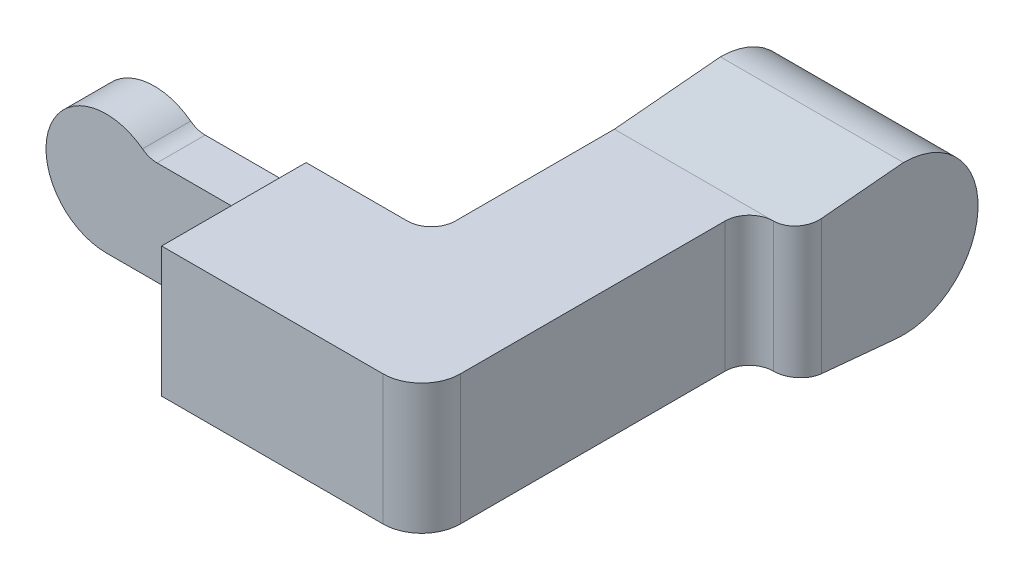
ISO-10303-21;
HEADER;
FILE_DESCRIPTION(('STEP AP214'),'2;1');
FILE_NAME('part.step','',(''),(''),'','','');
FILE_SCHEMA(('AUTOMOTIVE_DESIGN { 1 0 10303 214 1 1 1 1 }'));
ENDSEC;
DATA;
#1=APPLICATION_CONTEXT('core data for automotive mechanical design processes');
#2=APPLICATION_PROTOCOL_DEFINITION('international standard','automotive_design',2000,#1);
#3=PRODUCT_CONTEXT('',#1,'mechanical');
#4=PRODUCT('Part','Part','',(#3));
#5=PRODUCT_RELATED_PRODUCT_CATEGORY('part','',(#4));
#6=PRODUCT_DEFINITION_FORMATION('','',#4);
#7=PRODUCT_DEFINITION_CONTEXT('part definition',#1,'design');
#8=PRODUCT_DEFINITION('design','',#6,#7);
#9=PRODUCT_DEFINITION_SHAPE('','',#8);
#10=(LENGTH_UNIT() NAMED_UNIT(*) SI_UNIT(.MILLI.,.METRE.));
#11=(NAMED_UNIT(*) PLANE_ANGLE_UNIT() SI_UNIT($,.RADIAN.));
#12=(NAMED_UNIT(*) SI_UNIT($,.STERADIAN.) SOLID_ANGLE_UNIT());
#13=UNCERTAINTY_MEASURE_WITH_UNIT(LENGTH_MEASURE(1.E-05),#10,'distance_accuracy_value','');
#14=(GEOMETRIC_REPRESENTATION_CONTEXT(3) GLOBAL_UNCERTAINTY_ASSIGNED_CONTEXT((#13)) GLOBAL_UNIT_ASSIGNED_CONTEXT((#10,
#11,#12)) REPRESENTATION_CONTEXT('',''));
#15=CARTESIAN_POINT('',(0.,0.,0.));
#16=DIRECTION('',(0.,0.,1.));
#17=DIRECTION('',(1.,0.,0.));
#18=AXIS2_PLACEMENT_3D('',#15,#16,#17);
#19=CARTESIAN_POINT('',(59.,0.,-73.));
#20=DIRECTION('',(0.,-1.,0.));
#21=DIRECTION('',(0.,0.,-1.));
#22=AXIS2_PLACEMENT_3D('',#19,#20,#21);
#23=CYLINDRICAL_SURFACE('',#22,5.);
#24=DIRECTION('',(0.,1.,0.));
#25=VECTOR('',#24,1.);
#26=CARTESIAN_POINT('',(59.,-13.5,-68.));
#27=LINE('',#26,#25);
#28=CARTESIAN_POINT('',(59.,13.5,-68.));
#29=VERTEX_POINT('',#28);
#30=CARTESIAN_POINT('',(59.,-13.5,-68.));
#31=VERTEX_POINT('',#30);
#32=EDGE_CURVE('E291',#29,#31,#27,.F.);
#33=ORIENTED_EDGE('',*,*,#32,.T.);
#34=CARTESIAN_POINT('',(59.,-13.970079904175,-73.));
#35=DIRECTION('',(0.,-0.995609581526614,0.0936032113359417));
#36=DIRECTION('',(0.,-0.0936032113359417,-0.995609581526614));
#37=AXIS2_PLACEMENT_3D('',#34,#35,#36);
#38=ELLIPSE('',#37,5.02204889624834,5.);
#39=CARTESIAN_POINT('',(64.,-13.970079904175,-73.));
#40=VERTEX_POINT('',#39);
#41=EDGE_CURVE('E41',#40,#31,#38,.T.);
#42=ORIENTED_EDGE('',*,*,#41,.F.);
#43=DIRECTION('',(0.,1.,0.));
#44=VECTOR('',#43,1.);
#45=CARTESIAN_POINT('',(64.,0.,-73.));
#46=LINE('',#45,#44);
#47=CARTESIAN_POINT('',(64.,13.9545454545455,-73.));
#48=VERTEX_POINT('',#47);
#49=EDGE_CURVE('E298',#48,#40,#46,.F.);
#50=ORIENTED_EDGE('',*,*,#49,.F.);
#51=CARTESIAN_POINT('',(59.,13.9545454545455,-73.));
#52=DIRECTION('',(0.,0.995893206467704,0.0905357460425184));
#53=DIRECTION('',(0.,-0.0905357460425184,0.995893206467704));
#54=AXIS2_PLACEMENT_3D('',#51,#52,#53);
#55=ELLIPSE('',#54,5.02061864417603,5.);
#56=EDGE_CURVE('E11',#29,#48,#55,.T.);
#57=ORIENTED_EDGE('',*,*,#56,.F.);
#58=EDGE_LOOP('',(#33,#42,#50,#57));
#59=FACE_BOUND('',#58,.T.);
#60=ADVANCED_FACE('F34',(#59),#23,.T.);
#61=CARTESIAN_POINT('',(59.,-13.5,-63.));
#62=DIRECTION('',(0.,-1.,0.));
#63=DIRECTION('',(0.,0.,-1.));
#64=AXIS2_PLACEMENT_3D('',#61,#62,#63);
#65=CYLINDRICAL_SURFACE('',#64,5.);
#66=DIRECTION('',(0.,1.,0.));
#67=VECTOR('',#66,1.);
#68=CARTESIAN_POINT('',(54.,-13.5,-63.));
#69=LINE('',#68,#67);
#70=CARTESIAN_POINT('',(54.,-13.5,-63.));
#71=VERTEX_POINT('',#70);
#72=CARTESIAN_POINT('',(54.,13.5,-63.));
#73=VERTEX_POINT('',#72);
#74=EDGE_CURVE('E269',#71,#73,#69,.T.);
#75=ORIENTED_EDGE('',*,*,#74,.F.);
#76=CARTESIAN_POINT('',(59.,-13.5,-63.));
#77=DIRECTION('',(0.,1.,0.));
#78=DIRECTION('',(0.,0.,1.));
#79=AXIS2_PLACEMENT_3D('',#76,#77,#78);
#80=CIRCLE('',#79,5.);
#81=EDGE_CURVE('E293',#71,#31,#80,.F.);
#82=ORIENTED_EDGE('',*,*,#81,.T.);
#83=ORIENTED_EDGE('',*,*,#32,.F.);
#84=CARTESIAN_POINT('',(59.,13.5,-63.));
#85=DIRECTION('',(0.,1.,0.));
#86=DIRECTION('',(0.,0.,1.));
#87=AXIS2_PLACEMENT_3D('',#84,#85,#86);
#88=CIRCLE('',#87,5.);
#89=EDGE_CURVE('E296',#29,#73,#88,.T.);
#90=ORIENTED_EDGE('',*,*,#89,.T.);
#91=EDGE_LOOP('',(#75,#82,#83,#90));
#92=FACE_BOUND('',#91,.T.);
#93=ADVANCED_FACE('F313',(#92),#65,.F.);
#94=CARTESIAN_POINT('',(-2.,-1.,-18.));
#95=DIRECTION('',(0.,-1.,0.));
#96=DIRECTION('',(0.,0.,-1.));
#97=AXIS2_PLACEMENT_3D('',#94,#95,#96);
#98=CYLINDRICAL_SURFACE('',#97,2.);
#99=CARTESIAN_POINT('',(-2.,9.96210215487392,-18.));
#100=DIRECTION('',(0.,0.707106781186547,-0.707106781186547));
#101=DIRECTION('',(0.,-0.707106781186547,-0.707106781186547));
#102=AXIS2_PLACEMENT_3D('',#99,#100,#101);
#103=ELLIPSE('',#102,2.82842712474619,2.);
#104=CARTESIAN_POINT('',(-2.,7.96210215487392,-20.));
#105=VERTEX_POINT('',#104);
#106=CARTESIAN_POINT('',(0.,9.96210215487392,-18.));
#107=VERTEX_POINT('',#106);
#108=EDGE_CURVE('E265',#105,#107,#103,.F.);
#109=ORIENTED_EDGE('',*,*,#108,.F.);
#110=DIRECTION('',(0.,1.,0.));
#111=VECTOR('',#110,1.);
#112=CARTESIAN_POINT('',(-2.,-1.,-20.));
#113=LINE('',#112,#111);
#114=CARTESIAN_POINT('',(-2.,-13.5,-20.));
#115=VERTEX_POINT('',#114);
#116=EDGE_CURVE('E231',#115,#105,#113,.T.);
#117=ORIENTED_EDGE('',*,*,#116,.F.);
#118=CARTESIAN_POINT('',(-2.,-13.5,-18.));
#119=DIRECTION('',(0.,1.,0.));
#120=DIRECTION('',(0.,0.,1.));
#121=AXIS2_PLACEMENT_3D('',#118,#119,#120);
#122=CIRCLE('',#121,2.);
#123=CARTESIAN_POINT('',(0.,-13.5,-18.));
#124=VERTEX_POINT('',#123);
#125=EDGE_CURVE('E263',#115,#124,#122,.F.);
#126=ORIENTED_EDGE('',*,*,#125,.T.);
#127=DIRECTION('',(0.,1.,0.));
#128=VECTOR('',#127,1.);
#129=CARTESIAN_POINT('',(0.,-1.,-18.));
#130=LINE('',#129,#128);
#131=EDGE_CURVE('E259',#107,#124,#130,.F.);
#132=ORIENTED_EDGE('',*,*,#131,.F.);
#133=EDGE_LOOP('',(#109,#117,#126,#132));
#134=FACE_BOUND('',#133,.T.);
#135=ADVANCED_FACE('F383',(#134),#98,.F.);
#136=CARTESIAN_POINT('',(-2.,9.96210215487392,-20.));
#137=DIRECTION('',(0.,0.,-1.));
#138=DIRECTION('',(-1.,0.,0.));
#139=AXIS2_PLACEMENT_3D('',#136,#137,#138);
#140=CYLINDRICAL_SURFACE('',#139,2.);
#141=DIRECTION('',(0.,0.,-1.));
#142=VECTOR('',#141,1.);
#143=CARTESIAN_POINT('',(-2.,7.96210215487392,-20.));
#144=LINE('',#143,#142);
#145=CARTESIAN_POINT('',(-2.,7.96210215487392,-30.));
#146=VERTEX_POINT('',#145);
#147=EDGE_CURVE('E260',#105,#146,#144,.T.);
#148=ORIENTED_EDGE('',*,*,#147,.F.);
#149=ORIENTED_EDGE('',*,*,#108,.T.);
#150=DIRECTION('',(0.,0.,-1.));
#151=VECTOR('',#150,1.);
#152=CARTESIAN_POINT('',(0.,9.96210215487392,-15.));
#153=LINE('',#152,#151);
#154=CARTESIAN_POINT('',(0.,9.96210215487392,-30.));
#155=VERTEX_POINT('',#154);
#156=EDGE_CURVE('E237',#155,#107,#153,.F.);
#157=ORIENTED_EDGE('',*,*,#156,.F.);
#158=CARTESIAN_POINT('',(-2.,9.96210215487392,-30.));
#159=DIRECTION('',(0.,0.,-1.));
#160=DIRECTION('',(-1.,0.,0.));
#161=AXIS2_PLACEMENT_3D('',#158,#159,#160);
#162=CIRCLE('',#161,2.);
#163=EDGE_CURVE('E267',#155,#146,#162,.T.);
#164=ORIENTED_EDGE('',*,*,#163,.T.);
#165=EDGE_LOOP('',(#148,#149,#157,#164));
#166=FACE_BOUND('',#165,.T.);
#167=ADVANCED_FACE('F359',(#166),#140,.F.);
#168=CARTESIAN_POINT('',(0.,-13.5,-15.));
#169=DIRECTION('',(-1.,0.,0.));
#170=DIRECTION('',(0.,0.,1.));
#171=AXIS2_PLACEMENT_3D('',#168,#169,#170);
#172=PLANE('',#171);
#173=ORIENTED_EDGE('',*,*,#156,.T.);
#174=ORIENTED_EDGE('',*,*,#131,.T.);
#175=DIRECTION('',(0.,0.,1.));
#176=VECTOR('',#175,1.);
#177=CARTESIAN_POINT('',(0.,-13.5,-15.));
#178=LINE('',#177,#176);
#179=CARTESIAN_POINT('',(0.,-13.5,0.));
#180=VERTEX_POINT('',#179);
#181=EDGE_CURVE('E223',#124,#180,#178,.T.);
#182=ORIENTED_EDGE('',*,*,#181,.T.);
#183=DIRECTION('',(0.,1.,0.));
#184=VECTOR('',#183,1.);
#185=CARTESIAN_POINT('',(0.,-13.5,0.));
#186=LINE('',#185,#184);
#187=CARTESIAN_POINT('',(0.,13.5,0.));
#188=VERTEX_POINT('',#187);
#189=EDGE_CURVE('E251',#180,#188,#186,.T.);
#190=ORIENTED_EDGE('',*,*,#189,.T.);
#191=DIRECTION('',(0.,0.,1.));
#192=VECTOR('',#191,1.);
#193=CARTESIAN_POINT('',(0.,13.5,-15.));
#194=LINE('',#193,#192);
#195=CARTESIAN_POINT('',(0.,13.5,-30.));
#196=VERTEX_POINT('',#195);
#197=EDGE_CURVE('E203',#196,#188,#194,.T.);
#198=ORIENTED_EDGE('',*,*,#197,.F.);
#199=DIRECTION('',(0.,1.,0.));
#200=VECTOR('',#199,1.);
#201=CARTESIAN_POINT('',(0.,-13.5,-30.));
#202=LINE('',#201,#200);
#203=EDGE_CURVE('E233',#155,#196,#202,.T.);
#204=ORIENTED_EDGE('',*,*,#203,.F.);
#205=EDGE_LOOP('',(#173,#174,#182,#190,#198,#204));
#206=FACE_BOUND('',#205,.T.);
#207=ADVANCED_FACE('F366',(#206),#172,.T.);
#208=CARTESIAN_POINT('',(21.,-13.5,-30.));
#209=DIRECTION('',(0.,0.,-1.));
#210=DIRECTION('',(-1.,0.,0.));
#211=AXIS2_PLACEMENT_3D('',#208,#209,#210);
#212=PLANE('',#211);
#213=ORIENTED_EDGE('',*,*,#163,.F.);
#214=ORIENTED_EDGE('',*,*,#203,.T.);
#215=DIRECTION('',(-1.,0.,0.));
#216=VECTOR('',#215,1.);
#217=CARTESIAN_POINT('',(21.,13.5,-30.));
#218=LINE('',#217,#216);
#219=CARTESIAN_POINT('',(21.,13.5,-30.));
#220=VERTEX_POINT('',#219);
#221=EDGE_CURVE('E220',#220,#196,#218,.T.);
#222=ORIENTED_EDGE('',*,*,#221,.F.);
#223=DIRECTION('',(0.,1.,0.));
#224=VECTOR('',#223,1.);
#225=CARTESIAN_POINT('',(21.,-13.5,-30.));
#226=LINE('',#225,#224);
#227=CARTESIAN_POINT('',(21.,-13.5,-30.));
#228=VERTEX_POINT('',#227);
#229=EDGE_CURVE('E236',#228,#220,#226,.T.);
#230=ORIENTED_EDGE('',*,*,#229,.F.);
#231=DIRECTION('',(-1.,0.,0.));
#232=VECTOR('',#231,1.);
#233=CARTESIAN_POINT('',(21.,-13.5,-30.));
#234=LINE('',#233,#232);
#235=CARTESIAN_POINT('',(-31.5,-13.5,-30.));
#236=VERTEX_POINT('',#235);
#237=EDGE_CURVE('E242',#228,#236,#234,.T.);
#238=ORIENTED_EDGE('',*,*,#237,.T.);
#239=CARTESIAN_POINT('',(-31.5,-1.,-30.));
#240=DIRECTION('',(0.,0.,1.));
#241=DIRECTION('',(1.,0.,0.));
#242=AXIS2_PLACEMENT_3D('',#239,#240,#241);
#243=CIRCLE('',#242,12.5);
#244=CARTESIAN_POINT('',(-23.9640418652566,8.97293011062423,-30.));
#245=VERTEX_POINT('',#244);
#246=EDGE_CURVE('E185',#245,#236,#243,.T.);
#247=ORIENTED_EDGE('',*,*,#246,.F.);
#248=CARTESIAN_POINT('',(-20.9496586113593,12.9621021548739,-30.));
#249=DIRECTION('',(0.,0.,-1.));
#250=DIRECTION('',(-1.,0.,0.));
#251=AXIS2_PLACEMENT_3D('',#248,#249,#250);
#252=CIRCLE('',#251,5.);
#253=CARTESIAN_POINT('',(-20.9496586113593,7.96210215487392,-30.));
#254=VERTEX_POINT('',#253);
#255=EDGE_CURVE('E190',#254,#245,#252,.T.);
#256=ORIENTED_EDGE('',*,*,#255,.F.);
#257=DIRECTION('',(-1.,0.,0.));
#258=VECTOR('',#257,1.);
#259=CARTESIAN_POINT('',(0.,7.96210215487392,-30.));
#260=LINE('',#259,#258);
#261=EDGE_CURVE('E180',#146,#254,#260,.T.);
#262=ORIENTED_EDGE('',*,*,#261,.F.);
#263=EDGE_LOOP('',(#213,#214,#222,#230,#238,#247,#256,#262));
#264=FACE_BOUND('',#263,.T.);
#265=ADVANCED_FACE('F335',(#264),#212,.T.);
#266=CARTESIAN_POINT('',(21.,-13.5,-35.));
#267=DIRECTION('',(0.,1.,0.));
#268=DIRECTION('',(0.,0.,1.));
#269=AXIS2_PLACEMENT_3D('',#266,#267,#268);
#270=CYLINDRICAL_SURFACE('',#269,5.);
#271=ORIENTED_EDGE('',*,*,#229,.T.);
#272=CARTESIAN_POINT('',(21.,13.5,-35.));
#273=DIRECTION('',(0.,-1.,0.));
#274=DIRECTION('',(0.,0.,1.));
#275=AXIS2_PLACEMENT_3D('',#272,#273,#274);
#276=CIRCLE('',#275,5.);
#277=CARTESIAN_POINT('',(26.,13.5,-35.));
#278=VERTEX_POINT('',#277);
#279=EDGE_CURVE('E216',#278,#220,#276,.T.);
#280=ORIENTED_EDGE('',*,*,#279,.F.);
#281=DIRECTION('',(0.,1.,0.));
#282=VECTOR('',#281,1.);
#283=CARTESIAN_POINT('',(26.,-13.5,-35.));
#284=LINE('',#283,#282);
#285=CARTESIAN_POINT('',(26.,-13.5,-35.));
#286=VERTEX_POINT('',#285);
#287=EDGE_CURVE('E245',#286,#278,#284,.T.);
#288=ORIENTED_EDGE('',*,*,#287,.F.);
#289=CARTESIAN_POINT('',(21.,-13.5,-35.));
#290=DIRECTION('',(0.,-1.,0.));
#291=DIRECTION('',(0.,0.,1.));
#292=AXIS2_PLACEMENT_3D('',#289,#290,#291);
#293=CIRCLE('',#292,5.);
#294=EDGE_CURVE('E329',#286,#228,#293,.T.);
#295=ORIENTED_EDGE('',*,*,#294,.T.);
#296=EDGE_LOOP('',(#271,#280,#288,#295));
#297=FACE_BOUND('',#296,.T.);
#298=ADVANCED_FACE('F368',(#297),#270,.F.);
#299=CARTESIAN_POINT('',(26.,-13.5,-68.));
#300=DIRECTION('',(-1.,0.,0.));
#301=DIRECTION('',(0.,0.,1.));
#302=AXIS2_PLACEMENT_3D('',#299,#300,#301);
#303=PLANE('',#302);
#304=ORIENTED_EDGE('',*,*,#287,.T.);
#305=DIRECTION('',(0.,0.,1.));
#306=VECTOR('',#305,1.);
#307=CARTESIAN_POINT('',(26.,13.5,-68.));
#308=LINE('',#307,#306);
#309=CARTESIAN_POINT('',(26.,13.5,-68.));
#310=VERTEX_POINT('',#309);
#311=EDGE_CURVE('E213',#310,#278,#308,.T.);
#312=ORIENTED_EDGE('',*,*,#311,.F.);
#313=DIRECTION('',(0.,0.0905357460425184,-0.995893206467704));
#314=VECTOR('',#313,1.);
#315=CARTESIAN_POINT('',(26.,7.25819672131148,0.659836065573768));
#316=LINE('',#315,#314);
#317=CARTESIAN_POINT('',(26.,15.5,-90.));
#318=VERTEX_POINT('',#317);
#319=EDGE_CURVE('E175',#310,#318,#316,.T.);
#320=ORIENTED_EDGE('',*,*,#319,.T.);
#321=CARTESIAN_POINT('',(26.,0.,-90.));
#322=DIRECTION('',(-1.,0.,0.));
#323=DIRECTION('',(0.,0.,1.));
#324=AXIS2_PLACEMENT_3D('',#321,#322,#323);
#325=CIRCLE('',#324,15.5);
#326=CARTESIAN_POINT('',(26.,-15.4319485136625,-88.5491502242929));
#327=VERTEX_POINT('',#326);
#328=EDGE_CURVE('E164',#318,#327,#325,.T.);
#329=ORIENTED_EDGE('',*,*,#328,.T.);
#330=DIRECTION('',(0.,0.0936032113359417,0.995609581526614));
#331=VECTOR('',#330,1.);
#332=CARTESIAN_POINT('',(26.,-7.04464564756735,0.662309270191007));
#333=LINE('',#332,#331);
#334=CARTESIAN_POINT('',(26.,-13.5,-68.));
#335=VERTEX_POINT('',#334);
#336=EDGE_CURVE('E158',#327,#335,#333,.T.);
#337=ORIENTED_EDGE('',*,*,#336,.T.);
#338=DIRECTION('',(0.,0.,1.));
#339=VECTOR('',#338,1.);
#340=CARTESIAN_POINT('',(26.,-13.5,-68.));
#341=LINE('',#340,#339);
#342=EDGE_CURVE('E280',#335,#286,#341,.T.);
#343=ORIENTED_EDGE('',*,*,#342,.T.);
#344=EDGE_LOOP('',(#304,#312,#320,#329,#337,#343));
#345=FACE_BOUND('',#344,.T.);
#346=ADVANCED_FACE('F370',(#345),#303,.T.);
#347=CARTESIAN_POINT('',(54.,-13.5,-8.00000000000006));
#348=DIRECTION('',(1.,0.,0.));
#349=DIRECTION('',(0.,0.,-1.));
#350=AXIS2_PLACEMENT_3D('',#347,#348,#349);
#351=PLANE('',#350);
#352=DIRECTION('',(0.,0.,-1.));
#353=VECTOR('',#352,1.);
#354=CARTESIAN_POINT('',(54.,-13.5,-8.00000000000006));
#355=LINE('',#354,#353);
#356=CARTESIAN_POINT('',(54.,-13.5,-8.00000000000005));
#357=VERTEX_POINT('',#356);
#358=EDGE_CURVE('E281',#357,#71,#355,.T.);
#359=ORIENTED_EDGE('',*,*,#358,.T.);
#360=ORIENTED_EDGE('',*,*,#74,.T.);
#361=DIRECTION('',(0.,0.,-1.));
#362=VECTOR('',#361,1.);
#363=CARTESIAN_POINT('',(54.,13.5,-8.00000000000006));
#364=LINE('',#363,#362);
#365=CARTESIAN_POINT('',(54.,13.5,-8.00000000000005));
#366=VERTEX_POINT('',#365);
#367=EDGE_CURVE('E212',#366,#73,#364,.T.);
#368=ORIENTED_EDGE('',*,*,#367,.F.);
#369=DIRECTION('',(0.,1.,0.));
#370=VECTOR('',#369,1.);
#371=CARTESIAN_POINT('',(54.,-13.5,-8.00000000000005));
#372=LINE('',#371,#370);
#373=EDGE_CURVE('E247',#357,#366,#372,.T.);
#374=ORIENTED_EDGE('',*,*,#373,.F.);
#375=EDGE_LOOP('',(#359,#360,#368,#374));
#376=FACE_BOUND('',#375,.T.);
#377=ADVANCED_FACE('F320',(#376),#351,.T.);
#378=CARTESIAN_POINT('',(46.,-13.5,-8.));
#379=DIRECTION('',(0.,1.,0.));
#380=DIRECTION('',(0.,0.,1.));
#381=AXIS2_PLACEMENT_3D('',#378,#379,#380);
#382=CYLINDRICAL_SURFACE('',#381,8.);
#383=ORIENTED_EDGE('',*,*,#373,.T.);
#384=CARTESIAN_POINT('',(46.,13.5,-8.));
#385=DIRECTION('',(0.,1.,0.));
#386=DIRECTION('',(0.,0.,1.));
#387=AXIS2_PLACEMENT_3D('',#384,#385,#386);
#388=CIRCLE('',#387,8.);
#389=CARTESIAN_POINT('',(45.9999999999999,13.5,0.));
#390=VERTEX_POINT('',#389);
#391=EDGE_CURVE('E209',#390,#366,#388,.T.);
#392=ORIENTED_EDGE('',*,*,#391,.F.);
#393=DIRECTION('',(0.,1.,0.));
#394=VECTOR('',#393,1.);
#395=CARTESIAN_POINT('',(45.9999999999999,-13.5,0.));
#396=LINE('',#395,#394);
#397=CARTESIAN_POINT('',(45.9999999999999,-13.5,0.));
#398=VERTEX_POINT('',#397);
#399=EDGE_CURVE('E249',#398,#390,#396,.T.);
#400=ORIENTED_EDGE('',*,*,#399,.F.);
#401=CARTESIAN_POINT('',(46.,-13.5,-8.));
#402=DIRECTION('',(0.,1.,0.));
#403=DIRECTION('',(0.,0.,1.));
#404=AXIS2_PLACEMENT_3D('',#401,#402,#403);
#405=CIRCLE('',#404,8.);
#406=EDGE_CURVE('E286',#398,#357,#405,.T.);
#407=ORIENTED_EDGE('',*,*,#406,.T.);
#408=EDGE_LOOP('',(#383,#392,#400,#407));
#409=FACE_BOUND('',#408,.T.);
#410=ADVANCED_FACE('F326',(#409),#382,.T.);
#411=CARTESIAN_POINT('',(0.,-13.5,0.));
#412=DIRECTION('',(0.,0.,1.));
#413=DIRECTION('',(1.,0.,0.));
#414=AXIS2_PLACEMENT_3D('',#411,#412,#413);
#415=PLANE('',#414);
#416=ORIENTED_EDGE('',*,*,#399,.T.);
#417=DIRECTION('',(1.,0.,0.));
#418=VECTOR('',#417,1.);
#419=CARTESIAN_POINT('',(0.,13.5,0.));
#420=LINE('',#419,#418);
#421=EDGE_CURVE('E206',#188,#390,#420,.T.);
#422=ORIENTED_EDGE('',*,*,#421,.F.);
#423=ORIENTED_EDGE('',*,*,#189,.F.);
#424=DIRECTION('',(1.,0.,0.));
#425=VECTOR('',#424,1.);
#426=CARTESIAN_POINT('',(0.,-13.5,0.));
#427=LINE('',#426,#425);
#428=EDGE_CURVE('E226',#180,#398,#427,.T.);
#429=ORIENTED_EDGE('',*,*,#428,.T.);
#430=EDGE_LOOP('',(#416,#422,#423,#429));
#431=FACE_BOUND('',#430,.T.);
#432=ADVANCED_FACE('F392',(#431),#415,.T.);
#433=CARTESIAN_POINT('',(46.,-13.5,-8.));
#434=DIRECTION('',(0.,1.,0.));
#435=DIRECTION('',(0.,0.,1.));
#436=AXIS2_PLACEMENT_3D('',#433,#434,#435);
#437=PLANE('',#436);
#438=ORIENTED_EDGE('',*,*,#181,.F.);
#439=ORIENTED_EDGE('',*,*,#125,.F.);
#440=DIRECTION('',(1.,0.,0.));
#441=VECTOR('',#440,1.);
#442=CARTESIAN_POINT('',(0.,-13.5,-20.));
#443=LINE('',#442,#441);
#444=CARTESIAN_POINT('',(-31.5,-13.5,-20.));
#445=VERTEX_POINT('',#444);
#446=EDGE_CURVE('E189',#445,#115,#443,.T.);
#447=ORIENTED_EDGE('',*,*,#446,.F.);
#448=DIRECTION('',(0.,0.,-1.));
#449=VECTOR('',#448,1.);
#450=CARTESIAN_POINT('',(-31.5,-13.5,-20.));
#451=LINE('',#450,#449);
#452=EDGE_CURVE('E194',#445,#236,#451,.T.);
#453=ORIENTED_EDGE('',*,*,#452,.T.);
#454=ORIENTED_EDGE('',*,*,#237,.F.);
#455=ORIENTED_EDGE('',*,*,#294,.F.);
#456=ORIENTED_EDGE('',*,*,#342,.F.);
#457=DIRECTION('',(-1.,0.,0.));
#458=VECTOR('',#457,1.);
#459=CARTESIAN_POINT('',(54.,-13.5,-68.));
#460=LINE('',#459,#458);
#461=EDGE_CURVE('E278',#31,#335,#460,.T.);
#462=ORIENTED_EDGE('',*,*,#461,.F.);
#463=ORIENTED_EDGE('',*,*,#81,.F.);
#464=ORIENTED_EDGE('',*,*,#358,.F.);
#465=ORIENTED_EDGE('',*,*,#406,.F.);
#466=ORIENTED_EDGE('',*,*,#428,.F.);
#467=EDGE_LOOP('',(#438,#439,#447,#453,#454,#455,#456,#462,#463,#464,#465,#466));
#468=FACE_BOUND('',#467,.T.);
#469=ADVANCED_FACE('F306',(#468),#437,.F.);
#470=CARTESIAN_POINT('',(46.,13.5,-8.));
#471=DIRECTION('',(0.,1.,0.));
#472=DIRECTION('',(0.,0.,1.));
#473=AXIS2_PLACEMENT_3D('',#470,#471,#472);
#474=PLANE('',#473);
#475=ORIENTED_EDGE('',*,*,#197,.T.);
#476=ORIENTED_EDGE('',*,*,#421,.T.);
#477=ORIENTED_EDGE('',*,*,#391,.T.);
#478=ORIENTED_EDGE('',*,*,#367,.T.);
#479=ORIENTED_EDGE('',*,*,#89,.F.);
#480=DIRECTION('',(-1.,0.,0.));
#481=VECTOR('',#480,1.);
#482=CARTESIAN_POINT('',(54.,13.5,-68.));
#483=LINE('',#482,#481);
#484=EDGE_CURVE('E217',#29,#310,#483,.T.);
#485=ORIENTED_EDGE('',*,*,#484,.T.);
#486=ORIENTED_EDGE('',*,*,#311,.T.);
#487=ORIENTED_EDGE('',*,*,#279,.T.);
#488=ORIENTED_EDGE('',*,*,#221,.T.);
#489=EDGE_LOOP('',(#475,#476,#477,#478,#479,#485,#486,#487,#488));
#490=FACE_BOUND('',#489,.T.);
#491=ADVANCED_FACE('F317',(#490),#474,.T.);
#492=CARTESIAN_POINT('',(0.,7.96210215487392,-20.));
#493=DIRECTION('',(0.,-1.,0.));
#494=DIRECTION('',(0.,0.,-1.));
#495=AXIS2_PLACEMENT_3D('',#492,#493,#494);
#496=PLANE('',#495);
#497=DIRECTION('',(-1.,0.,0.));
#498=VECTOR('',#497,1.);
#499=CARTESIAN_POINT('',(0.,7.96210215487392,-20.));
#500=LINE('',#499,#498);
#501=CARTESIAN_POINT('',(-20.9496586113593,7.96210215487392,-20.));
#502=VERTEX_POINT('',#501);
#503=EDGE_CURVE('E182',#105,#502,#500,.T.);
#504=ORIENTED_EDGE('',*,*,#503,.F.);
#505=ORIENTED_EDGE('',*,*,#147,.T.);
#506=ORIENTED_EDGE('',*,*,#261,.T.);
#507=DIRECTION('',(0.,0.,-1.));
#508=VECTOR('',#507,1.);
#509=CARTESIAN_POINT('',(-20.9496586113593,7.96210215487392,-20.));
#510=LINE('',#509,#508);
#511=EDGE_CURVE('E200',#502,#254,#510,.T.);
#512=ORIENTED_EDGE('',*,*,#511,.F.);
#513=EDGE_LOOP('',(#504,#505,#506,#512));
#514=FACE_BOUND('',#513,.T.);
#515=ADVANCED_FACE('F356',(#514),#496,.F.);
#516=CARTESIAN_POINT('',(-20.9496586113593,12.9621021548739,-20.));
#517=DIRECTION('',(0.,0.,-1.));
#518=DIRECTION('',(-1.,0.,0.));
#519=AXIS2_PLACEMENT_3D('',#516,#517,#518);
#520=CYLINDRICAL_SURFACE('',#519,5.);
#521=ORIENTED_EDGE('',*,*,#255,.T.);
#522=DIRECTION('',(0.,0.,-1.));
#523=VECTOR('',#522,1.);
#524=CARTESIAN_POINT('',(-23.9640418652566,8.97293011062423,-20.));
#525=LINE('',#524,#523);
#526=CARTESIAN_POINT('',(-23.9640418652566,8.97293011062423,-20.));
#527=VERTEX_POINT('',#526);
#528=EDGE_CURVE('E197',#527,#245,#525,.T.);
#529=ORIENTED_EDGE('',*,*,#528,.F.);
#530=CARTESIAN_POINT('',(-20.9496586113593,12.9621021548739,-20.));
#531=DIRECTION('',(0.,0.,-1.));
#532=DIRECTION('',(-1.,0.,0.));
#533=AXIS2_PLACEMENT_3D('',#530,#531,#532);
#534=CIRCLE('',#533,5.);
#535=EDGE_CURVE('E184',#502,#527,#534,.T.);
#536=ORIENTED_EDGE('',*,*,#535,.F.);
#537=ORIENTED_EDGE('',*,*,#511,.T.);
#538=EDGE_LOOP('',(#521,#529,#536,#537));
#539=FACE_BOUND('',#538,.T.);
#540=ADVANCED_FACE('F352',(#539),#520,.F.);
#541=CARTESIAN_POINT('',(-31.5,-1.,-20.));
#542=DIRECTION('',(0.,0.,-1.));
#543=DIRECTION('',(-1.,0.,0.));
#544=AXIS2_PLACEMENT_3D('',#541,#542,#543);
#545=CYLINDRICAL_SURFACE('',#544,12.5);
#546=ORIENTED_EDGE('',*,*,#246,.T.);
#547=ORIENTED_EDGE('',*,*,#452,.F.);
#548=CARTESIAN_POINT('',(-31.5,-1.,-20.));
#549=DIRECTION('',(0.,0.,1.));
#550=DIRECTION('',(1.,0.,0.));
#551=AXIS2_PLACEMENT_3D('',#548,#549,#550);
#552=CIRCLE('',#551,12.5);
#553=EDGE_CURVE('E187',#527,#445,#552,.T.);
#554=ORIENTED_EDGE('',*,*,#553,.F.);
#555=ORIENTED_EDGE('',*,*,#528,.T.);
#556=EDGE_LOOP('',(#546,#547,#554,#555));
#557=FACE_BOUND('',#556,.T.);
#558=ADVANCED_FACE('F340',(#557),#545,.T.);
#559=CARTESIAN_POINT('',(-31.5,-1.,-20.));
#560=DIRECTION('',(0.,0.,1.));
#561=DIRECTION('',(1.,0.,0.));
#562=AXIS2_PLACEMENT_3D('',#559,#560,#561);
#563=PLANE('',#562);
#564=ORIENTED_EDGE('',*,*,#446,.T.);
#565=ORIENTED_EDGE('',*,*,#116,.T.);
#566=ORIENTED_EDGE('',*,*,#503,.T.);
#567=ORIENTED_EDGE('',*,*,#535,.T.);
#568=ORIENTED_EDGE('',*,*,#553,.T.);
#569=EDGE_LOOP('',(#564,#565,#566,#567,#568));
#570=FACE_BOUND('',#569,.T.);
#571=ADVANCED_FACE('F347',(#570),#563,.T.);
#572=CARTESIAN_POINT('',(64.,7.25819672131148,0.659836065573764));
#573=DIRECTION('',(0.,0.995893206467704,0.0905357460425184));
#574=DIRECTION('',(0.,-0.0905357460425184,0.995893206467704));
#575=AXIS2_PLACEMENT_3D('',#572,#573,#574);
#576=PLANE('',#575);
#577=ORIENTED_EDGE('',*,*,#484,.F.);
#578=ORIENTED_EDGE('',*,*,#56,.T.);
#579=DIRECTION('',(0.,0.0905357460425184,-0.995893206467704));
#580=VECTOR('',#579,1.);
#581=CARTESIAN_POINT('',(64.,7.25819672131148,0.659836065573764));
#582=LINE('',#581,#580);
#583=CARTESIAN_POINT('',(64.,15.5,-90.));
#584=VERTEX_POINT('',#583);
#585=EDGE_CURVE('E150',#48,#584,#582,.T.);
#586=ORIENTED_EDGE('',*,*,#585,.T.);
#587=DIRECTION('',(-1.,0.,0.));
#588=VECTOR('',#587,1.);
#589=CARTESIAN_POINT('',(64.,15.5,-90.));
#590=LINE('',#589,#588);
#591=EDGE_CURVE('E153',#584,#318,#590,.T.);
#592=ORIENTED_EDGE('',*,*,#591,.T.);
#593=ORIENTED_EDGE('',*,*,#319,.F.);
#594=EDGE_LOOP('',(#577,#578,#586,#592,#593));
#595=FACE_BOUND('',#594,.T.);
#596=ADVANCED_FACE('F152',(#595),#576,.T.);
#597=CARTESIAN_POINT('',(64.,-7.04464564756735,0.662309270191003));
#598=DIRECTION('',(0.,-0.995609581526614,0.0936032113359417));
#599=DIRECTION('',(0.,-0.0936032113359417,-0.995609581526614));
#600=AXIS2_PLACEMENT_3D('',#597,#598,#599);
#601=PLANE('',#600);
#602=DIRECTION('',(0.,0.0936032113359417,0.995609581526614));
#603=VECTOR('',#602,1.);
#604=CARTESIAN_POINT('',(64.,-7.04464564756735,0.662309270191003));
#605=LINE('',#604,#603);
#606=CARTESIAN_POINT('',(64.,-15.4319485136625,-88.5491502242929));
#607=VERTEX_POINT('',#606);
#608=EDGE_CURVE('E167',#607,#40,#605,.T.);
#609=ORIENTED_EDGE('',*,*,#608,.T.);
#610=ORIENTED_EDGE('',*,*,#41,.T.);
#611=ORIENTED_EDGE('',*,*,#461,.T.);
#612=ORIENTED_EDGE('',*,*,#336,.F.);
#613=DIRECTION('',(-1.,0.,0.));
#614=VECTOR('',#613,1.);
#615=CARTESIAN_POINT('',(64.,-15.4319485136625,-88.5491502242929));
#616=LINE('',#615,#614);
#617=EDGE_CURVE('E166',#607,#327,#616,.T.);
#618=ORIENTED_EDGE('',*,*,#617,.F.);
#619=EDGE_LOOP('',(#609,#610,#611,#612,#618));
#620=FACE_BOUND('',#619,.T.);
#621=ADVANCED_FACE('F301',(#620),#601,.T.);
#622=CARTESIAN_POINT('',(64.,0.,-90.));
#623=DIRECTION('',(-1.,0.,0.));
#624=DIRECTION('',(0.,0.,1.));
#625=AXIS2_PLACEMENT_3D('',#622,#623,#624);
#626=CYLINDRICAL_SURFACE('',#625,15.5);
#627=ORIENTED_EDGE('',*,*,#328,.F.);
#628=ORIENTED_EDGE('',*,*,#591,.F.);
#629=CARTESIAN_POINT('',(64.,0.,-90.));
#630=DIRECTION('',(-1.,0.,0.));
#631=DIRECTION('',(0.,0.,1.));
#632=AXIS2_PLACEMENT_3D('',#629,#630,#631);
#633=CIRCLE('',#632,15.5);
#634=EDGE_CURVE('E157',#584,#607,#633,.T.);
#635=ORIENTED_EDGE('',*,*,#634,.T.);
#636=ORIENTED_EDGE('',*,*,#617,.T.);
#637=EDGE_LOOP('',(#627,#628,#635,#636));
#638=FACE_BOUND('',#637,.T.);
#639=ADVANCED_FACE('F162',(#638),#626,.T.);
#640=CARTESIAN_POINT('',(64.,0.,0.));
#641=DIRECTION('',(-1.,0.,0.));
#642=DIRECTION('',(0.,0.,1.));
#643=AXIS2_PLACEMENT_3D('',#640,#641,#642);
#644=PLANE('',#643);
#645=ORIENTED_EDGE('',*,*,#585,.F.);
#646=ORIENTED_EDGE('',*,*,#49,.T.);
#647=ORIENTED_EDGE('',*,*,#608,.F.);
#648=ORIENTED_EDGE('',*,*,#634,.F.);
#649=EDGE_LOOP('',(#645,#646,#647,#648));
#650=FACE_BOUND('',#649,.T.);
#651=ADVANCED_FACE('F170',(#650),#644,.F.);
#652=CLOSED_SHELL('',(#60,#93,#135,#167,#207,#265,#298,#346,#377,#410,#432,#469,#491,#515,#540,
#558,#571,#596,#621,#639,#651));
#653=MANIFOLD_SOLID_BREP('B2',#652);
#654=ADVANCED_BREP_SHAPE_REPRESENTATION('',(#18,#653),#14);
#655=SHAPE_DEFINITION_REPRESENTATION(#9,#654);
ENDSEC;
END-ISO-10303-21;
